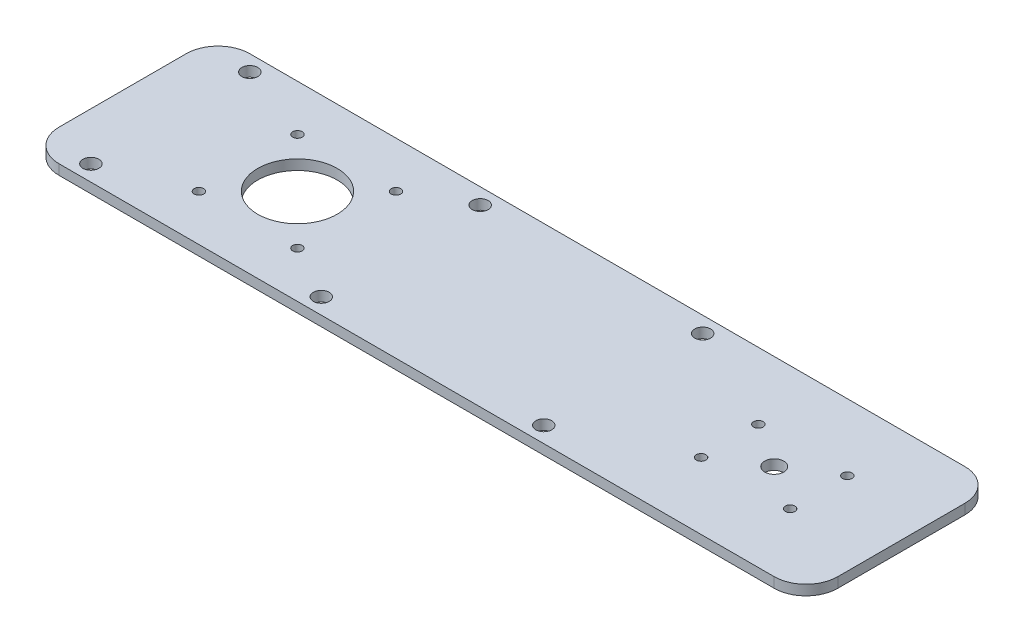
ISO-10303-21;
HEADER;
FILE_DESCRIPTION(('STEP AP214'),'2;1');
FILE_NAME('part.step','',(''),(''),'','','');
FILE_SCHEMA(('AUTOMOTIVE_DESIGN { 1 0 10303 214 1 1 1 1 }'));
ENDSEC;
DATA;
#1=APPLICATION_CONTEXT('core data for automotive mechanical design processes');
#2=APPLICATION_PROTOCOL_DEFINITION('international standard','automotive_design',2000,#1);
#3=PRODUCT_CONTEXT('',#1,'mechanical');
#4=PRODUCT('Part','Part','',(#3));
#5=PRODUCT_RELATED_PRODUCT_CATEGORY('part','',(#4));
#6=PRODUCT_DEFINITION_FORMATION('','',#4);
#7=PRODUCT_DEFINITION_CONTEXT('part definition',#1,'design');
#8=PRODUCT_DEFINITION('design','',#6,#7);
#9=PRODUCT_DEFINITION_SHAPE('','',#8);
#10=(LENGTH_UNIT() NAMED_UNIT(*) SI_UNIT(.MILLI.,.METRE.));
#11=(NAMED_UNIT(*) PLANE_ANGLE_UNIT() SI_UNIT($,.RADIAN.));
#12=(NAMED_UNIT(*) SI_UNIT($,.STERADIAN.) SOLID_ANGLE_UNIT());
#13=UNCERTAINTY_MEASURE_WITH_UNIT(LENGTH_MEASURE(1.E-05),#10,'distance_accuracy_value','');
#14=(GEOMETRIC_REPRESENTATION_CONTEXT(3) GLOBAL_UNCERTAINTY_ASSIGNED_CONTEXT((#13)) GLOBAL_UNIT_ASSIGNED_CONTEXT((#10,
#11,#12)) REPRESENTATION_CONTEXT('',''));
#15=CARTESIAN_POINT('',(0.,0.,0.));
#16=DIRECTION('',(0.,0.,1.));
#17=DIRECTION('',(1.,0.,0.));
#18=AXIS2_PLACEMENT_3D('',#15,#16,#17);
#19=CARTESIAN_POINT('',(0.,0.,0.));
#20=DIRECTION('',(0.,1.,0.));
#21=DIRECTION('',(0.,0.,1.));
#22=AXIS2_PLACEMENT_3D('',#19,#20,#21);
#23=PLANE('',#22);
#24=CARTESIAN_POINT('',(32.5,0.,25.));
#25=DIRECTION('',(0.,1.,0.));
#26=DIRECTION('',(0.,0.,1.));
#27=AXIS2_PLACEMENT_3D('',#24,#25,#26);
#28=CIRCLE('',#27,2.5);
#29=CARTESIAN_POINT('',(32.5,0.,27.5));
#30=VERTEX_POINT('',#29);
#31=EDGE_CURVE('E330',#30,#30,#28,.T.);
#32=ORIENTED_EDGE('',*,*,#31,.T.);
#33=EDGE_LOOP('',(#32));
#34=FACE_BOUND('',#33,.T.);
#35=CARTESIAN_POINT('',(102.5,0.,25.));
#36=DIRECTION('',(0.,1.,0.));
#37=DIRECTION('',(0.,0.,1.));
#38=AXIS2_PLACEMENT_3D('',#35,#36,#37);
#39=CIRCLE('',#38,2.5);
#40=CARTESIAN_POINT('',(102.5,0.,27.5));
#41=VERTEX_POINT('',#40);
#42=EDGE_CURVE('E322',#41,#41,#39,.T.);
#43=ORIENTED_EDGE('',*,*,#42,.T.);
#44=EDGE_LOOP('',(#43));
#45=FACE_BOUND('',#44,.T.);
#46=CARTESIAN_POINT('',(102.5,0.,-25.));
#47=DIRECTION('',(0.,1.,0.));
#48=DIRECTION('',(0.,0.,1.));
#49=AXIS2_PLACEMENT_3D('',#46,#47,#48);
#50=CIRCLE('',#49,2.5);
#51=CARTESIAN_POINT('',(102.5,0.,-22.5));
#52=VERTEX_POINT('',#51);
#53=EDGE_CURVE('E314',#52,#52,#50,.T.);
#54=ORIENTED_EDGE('',*,*,#53,.T.);
#55=EDGE_LOOP('',(#54));
#56=FACE_BOUND('',#55,.T.);
#57=CARTESIAN_POINT('',(32.5,0.,-25.));
#58=DIRECTION('',(0.,1.,0.));
#59=DIRECTION('',(0.,0.,1.));
#60=AXIS2_PLACEMENT_3D('',#57,#58,#59);
#61=CIRCLE('',#60,2.5);
#62=CARTESIAN_POINT('',(32.5,0.,-22.5));
#63=VERTEX_POINT('',#62);
#64=EDGE_CURVE('E306',#63,#63,#61,.T.);
#65=ORIENTED_EDGE('',*,*,#64,.T.);
#66=EDGE_LOOP('',(#65));
#67=FACE_BOUND('',#66,.T.);
#68=CARTESIAN_POINT('',(-40.,0.,25.));
#69=DIRECTION('',(0.,1.,0.));
#70=DIRECTION('',(0.,0.,1.));
#71=AXIS2_PLACEMENT_3D('',#68,#69,#70);
#72=CIRCLE('',#71,2.5);
#73=CARTESIAN_POINT('',(-40.,0.,27.5));
#74=VERTEX_POINT('',#73);
#75=EDGE_CURVE('E298',#74,#74,#72,.T.);
#76=ORIENTED_EDGE('',*,*,#75,.T.);
#77=EDGE_LOOP('',(#76));
#78=FACE_BOUND('',#77,.T.);
#79=CARTESIAN_POINT('',(-40.,0.,-25.));
#80=DIRECTION('',(0.,1.,0.));
#81=DIRECTION('',(0.,0.,1.));
#82=AXIS2_PLACEMENT_3D('',#79,#80,#81);
#83=CIRCLE('',#82,2.5);
#84=CARTESIAN_POINT('',(-40.,0.,-22.5));
#85=VERTEX_POINT('',#84);
#86=EDGE_CURVE('E290',#85,#85,#83,.T.);
#87=ORIENTED_EDGE('',*,*,#86,.T.);
#88=EDGE_LOOP('',(#87));
#89=FACE_BOUND('',#88,.T.);
#90=CARTESIAN_POINT('',(164.,0.,9.));
#91=DIRECTION('',(0.,-1.,0.));
#92=DIRECTION('',(0.,0.,-1.));
#93=AXIS2_PLACEMENT_3D('',#90,#91,#92);
#94=CIRCLE('',#93,1.5);
#95=CARTESIAN_POINT('',(164.,0.,7.5));
#96=VERTEX_POINT('',#95);
#97=EDGE_CURVE('E262',#96,#96,#94,.T.);
#98=ORIENTED_EDGE('',*,*,#97,.F.);
#99=EDGE_LOOP('',(#98));
#100=FACE_BOUND('',#99,.T.);
#101=CARTESIAN_POINT('',(150.,0.,0.));
#102=DIRECTION('',(0.,1.,0.));
#103=DIRECTION('',(0.,0.,1.));
#104=AXIS2_PLACEMENT_3D('',#101,#102,#103);
#105=CIRCLE('',#104,3.);
#106=CARTESIAN_POINT('',(150.,0.,3.));
#107=VERTEX_POINT('',#106);
#108=EDGE_CURVE('E247',#107,#107,#105,.T.);
#109=ORIENTED_EDGE('',*,*,#108,.T.);
#110=EDGE_LOOP('',(#109));
#111=FACE_BOUND('',#110,.T.);
#112=CARTESIAN_POINT('',(0.,0.,0.));
#113=DIRECTION('',(0.,1.,0.));
#114=DIRECTION('',(0.,0.,1.));
#115=AXIS2_PLACEMENT_3D('',#112,#113,#114);
#116=CIRCLE('',#115,12.5);
#117=CARTESIAN_POINT('',(0.,0.,12.5));
#118=VERTEX_POINT('',#117);
#119=EDGE_CURVE('E242',#118,#118,#116,.T.);
#120=ORIENTED_EDGE('',*,*,#119,.T.);
#121=EDGE_LOOP('',(#120));
#122=FACE_BOUND('',#121,.T.);
#123=CARTESIAN_POINT('',(-15.5,0.,-15.5));
#124=DIRECTION('',(0.,1.,0.));
#125=DIRECTION('',(0.,0.,1.));
#126=AXIS2_PLACEMENT_3D('',#123,#124,#125);
#127=CIRCLE('',#126,1.5);
#128=CARTESIAN_POINT('',(-15.5,0.,-14.));
#129=VERTEX_POINT('',#128);
#130=EDGE_CURVE('E234',#129,#129,#127,.T.);
#131=ORIENTED_EDGE('',*,*,#130,.T.);
#132=EDGE_LOOP('',(#131));
#133=FACE_BOUND('',#132,.T.);
#134=CARTESIAN_POINT('',(15.5,0.,-15.5000000000002));
#135=DIRECTION('',(0.,1.,0.));
#136=DIRECTION('',(0.,0.,1.));
#137=AXIS2_PLACEMENT_3D('',#134,#135,#136);
#138=CIRCLE('',#137,1.5);
#139=CARTESIAN_POINT('',(15.5,0.,-14.0000000000002));
#140=VERTEX_POINT('',#139);
#141=EDGE_CURVE('E226',#140,#140,#138,.T.);
#142=ORIENTED_EDGE('',*,*,#141,.T.);
#143=EDGE_LOOP('',(#142));
#144=FACE_BOUND('',#143,.T.);
#145=CARTESIAN_POINT('',(15.5,0.,15.4999999999998));
#146=DIRECTION('',(0.,1.,0.));
#147=DIRECTION('',(0.,0.,1.));
#148=AXIS2_PLACEMENT_3D('',#145,#146,#147);
#149=CIRCLE('',#148,1.5);
#150=CARTESIAN_POINT('',(15.5,0.,16.9999999999998));
#151=VERTEX_POINT('',#150);
#152=EDGE_CURVE('E218',#151,#151,#149,.T.);
#153=ORIENTED_EDGE('',*,*,#152,.T.);
#154=EDGE_LOOP('',(#153));
#155=FACE_BOUND('',#154,.T.);
#156=CARTESIAN_POINT('',(-15.5,0.,15.5000000000002));
#157=DIRECTION('',(0.,1.,0.));
#158=DIRECTION('',(0.,0.,1.));
#159=AXIS2_PLACEMENT_3D('',#156,#157,#158);
#160=CIRCLE('',#159,1.5);
#161=CARTESIAN_POINT('',(-15.5,0.,17.0000000000002));
#162=VERTEX_POINT('',#161);
#163=EDGE_CURVE('E145',#162,#162,#160,.T.);
#164=ORIENTED_EDGE('',*,*,#163,.T.);
#165=EDGE_LOOP('',(#164));
#166=FACE_BOUND('',#165,.T.);
#167=DIRECTION('',(1.,0.,0.));
#168=VECTOR('',#167,1.);
#169=CARTESIAN_POINT('',(-55.,0.,30.));
#170=LINE('',#169,#168);
#171=CARTESIAN_POINT('',(-45.,0.,30.));
#172=VERTEX_POINT('',#171);
#173=CARTESIAN_POINT('',(180.,0.,30.));
#174=VERTEX_POINT('',#173);
#175=EDGE_CURVE('E125',#172,#174,#170,.T.);
#176=ORIENTED_EDGE('',*,*,#175,.F.);
#177=CARTESIAN_POINT('',(-45.,0.,20.));
#178=DIRECTION('',(0.,1.,0.));
#179=DIRECTION('',(0.,0.,1.));
#180=AXIS2_PLACEMENT_3D('',#177,#178,#179);
#181=CIRCLE('',#180,10.);
#182=CARTESIAN_POINT('',(-55.,0.,20.));
#183=VERTEX_POINT('',#182);
#184=EDGE_CURVE('E107',#172,#183,#181,.F.);
#185=ORIENTED_EDGE('',*,*,#184,.T.);
#186=DIRECTION('',(0.,0.,1.));
#187=VECTOR('',#186,1.);
#188=CARTESIAN_POINT('',(-55.,0.,-30.));
#189=LINE('',#188,#187);
#190=CARTESIAN_POINT('',(-55.,0.,-20.));
#191=VERTEX_POINT('',#190);
#192=EDGE_CURVE('E138',#191,#183,#189,.T.);
#193=ORIENTED_EDGE('',*,*,#192,.F.);
#194=CARTESIAN_POINT('',(-45.,0.,-20.));
#195=DIRECTION('',(0.,1.,0.));
#196=DIRECTION('',(0.,0.,1.));
#197=AXIS2_PLACEMENT_3D('',#194,#195,#196);
#198=CIRCLE('',#197,10.);
#199=CARTESIAN_POINT('',(-45.,0.,-30.));
#200=VERTEX_POINT('',#199);
#201=EDGE_CURVE('E119',#191,#200,#198,.F.);
#202=ORIENTED_EDGE('',*,*,#201,.T.);
#203=DIRECTION('',(-1.,0.,0.));
#204=VECTOR('',#203,1.);
#205=CARTESIAN_POINT('',(-55.,0.,-30.));
#206=LINE('',#205,#204);
#207=CARTESIAN_POINT('',(180.,0.,-30.));
#208=VERTEX_POINT('',#207);
#209=EDGE_CURVE('E143',#208,#200,#206,.T.);
#210=ORIENTED_EDGE('',*,*,#209,.F.);
#211=CARTESIAN_POINT('',(180.,0.,-20.));
#212=DIRECTION('',(0.,1.,0.));
#213=DIRECTION('',(0.,0.,1.));
#214=AXIS2_PLACEMENT_3D('',#211,#212,#213);
#215=CIRCLE('',#214,10.);
#216=CARTESIAN_POINT('',(190.,0.,-20.));
#217=VERTEX_POINT('',#216);
#218=EDGE_CURVE('E130',#208,#217,#215,.F.);
#219=ORIENTED_EDGE('',*,*,#218,.T.);
#220=DIRECTION('',(0.,0.,-1.));
#221=VECTOR('',#220,1.);
#222=CARTESIAN_POINT('',(190.,0.,-30.));
#223=LINE('',#222,#221);
#224=CARTESIAN_POINT('',(190.,0.,20.));
#225=VERTEX_POINT('',#224);
#226=EDGE_CURVE('E137',#225,#217,#223,.T.);
#227=ORIENTED_EDGE('',*,*,#226,.F.);
#228=CARTESIAN_POINT('',(180.,0.,20.));
#229=DIRECTION('',(0.,1.,0.));
#230=DIRECTION('',(0.,0.,1.));
#231=AXIS2_PLACEMENT_3D('',#228,#229,#230);
#232=CIRCLE('',#231,10.);
#233=EDGE_CURVE('E135',#225,#174,#232,.F.);
#234=ORIENTED_EDGE('',*,*,#233,.T.);
#235=EDGE_LOOP('',(#176,#185,#193,#202,#210,#219,#227,#234));
#236=FACE_BOUND('',#235,.T.);
#237=CARTESIAN_POINT('',(136.,0.,9.));
#238=DIRECTION('',(0.,-1.,0.));
#239=DIRECTION('',(0.,0.,-1.));
#240=AXIS2_PLACEMENT_3D('',#237,#238,#239);
#241=CIRCLE('',#240,1.5);
#242=CARTESIAN_POINT('',(136.,0.,7.5));
#243=VERTEX_POINT('',#242);
#244=EDGE_CURVE('E270',#243,#243,#241,.T.);
#245=ORIENTED_EDGE('',*,*,#244,.F.);
#246=EDGE_LOOP('',(#245));
#247=FACE_BOUND('',#246,.T.);
#248=CARTESIAN_POINT('',(136.,0.,-9.));
#249=DIRECTION('',(0.,-1.,0.));
#250=DIRECTION('',(0.,0.,-1.));
#251=AXIS2_PLACEMENT_3D('',#248,#249,#250);
#252=CIRCLE('',#251,1.5);
#253=CARTESIAN_POINT('',(136.,0.,-10.5));
#254=VERTEX_POINT('',#253);
#255=EDGE_CURVE('E278',#254,#254,#252,.T.);
#256=ORIENTED_EDGE('',*,*,#255,.F.);
#257=EDGE_LOOP('',(#256));
#258=FACE_BOUND('',#257,.T.);
#259=CARTESIAN_POINT('',(164.,0.,-9.));
#260=DIRECTION('',(0.,-1.,0.));
#261=DIRECTION('',(0.,0.,-1.));
#262=AXIS2_PLACEMENT_3D('',#259,#260,#261);
#263=CIRCLE('',#262,1.5);
#264=CARTESIAN_POINT('',(164.,0.,-10.5));
#265=VERTEX_POINT('',#264);
#266=EDGE_CURVE('E286',#265,#265,#263,.T.);
#267=ORIENTED_EDGE('',*,*,#266,.F.);
#268=EDGE_LOOP('',(#267));
#269=FACE_BOUND('',#268,.T.);
#270=ADVANCED_FACE('F39',(#34,#45,#56,#67,#78,#89,#100,#111,#122,#133,#144,#155,#166,#236,#247,
#258,#269),#23,.F.);
#271=CARTESIAN_POINT('',(-55.,3.175,-30.));
#272=DIRECTION('',(1.,0.,0.));
#273=DIRECTION('',(0.,0.,-1.));
#274=AXIS2_PLACEMENT_3D('',#271,#272,#273);
#275=PLANE('',#274);
#276=ORIENTED_EDGE('',*,*,#192,.T.);
#277=DIRECTION('',(0.,-1.,0.));
#278=VECTOR('',#277,1.);
#279=CARTESIAN_POINT('',(-55.,3.175,20.));
#280=LINE('',#279,#278);
#281=CARTESIAN_POINT('',(-55.,3.175,20.));
#282=VERTEX_POINT('',#281);
#283=EDGE_CURVE('E112',#183,#282,#280,.F.);
#284=ORIENTED_EDGE('',*,*,#283,.T.);
#285=DIRECTION('',(0.,0.,1.));
#286=VECTOR('',#285,1.);
#287=CARTESIAN_POINT('',(-55.,3.175,-30.));
#288=LINE('',#287,#286);
#289=CARTESIAN_POINT('',(-55.,3.175,-20.));
#290=VERTEX_POINT('',#289);
#291=EDGE_CURVE('E151',#290,#282,#288,.T.);
#292=ORIENTED_EDGE('',*,*,#291,.F.);
#293=DIRECTION('',(0.,-1.,0.));
#294=VECTOR('',#293,1.);
#295=CARTESIAN_POINT('',(-55.,3.175,-20.));
#296=LINE('',#295,#294);
#297=EDGE_CURVE('E118',#290,#191,#296,.T.);
#298=ORIENTED_EDGE('',*,*,#297,.T.);
#299=EDGE_LOOP('',(#276,#284,#292,#298));
#300=FACE_BOUND('',#299,.T.);
#301=ADVANCED_FACE('F204',(#300),#275,.F.);
#302=CARTESIAN_POINT('',(-55.,3.175,30.));
#303=DIRECTION('',(0.,0.,-1.));
#304=DIRECTION('',(-1.,0.,0.));
#305=AXIS2_PLACEMENT_3D('',#302,#303,#304);
#306=PLANE('',#305);
#307=DIRECTION('',(1.,0.,0.));
#308=VECTOR('',#307,1.);
#309=CARTESIAN_POINT('',(-55.,3.175,30.));
#310=LINE('',#309,#308);
#311=CARTESIAN_POINT('',(-45.,3.175,30.));
#312=VERTEX_POINT('',#311);
#313=CARTESIAN_POINT('',(180.,3.175,30.));
#314=VERTEX_POINT('',#313);
#315=EDGE_CURVE('E128',#312,#314,#310,.T.);
#316=ORIENTED_EDGE('',*,*,#315,.F.);
#317=DIRECTION('',(0.,-1.,0.));
#318=VECTOR('',#317,1.);
#319=CARTESIAN_POINT('',(-45.,3.175,30.));
#320=LINE('',#319,#318);
#321=EDGE_CURVE('E111',#312,#172,#320,.T.);
#322=ORIENTED_EDGE('',*,*,#321,.T.);
#323=ORIENTED_EDGE('',*,*,#175,.T.);
#324=DIRECTION('',(0.,-1.,0.));
#325=VECTOR('',#324,1.);
#326=CARTESIAN_POINT('',(180.,3.175,30.));
#327=LINE('',#326,#325);
#328=EDGE_CURVE('E131',#174,#314,#327,.F.);
#329=ORIENTED_EDGE('',*,*,#328,.T.);
#330=EDGE_LOOP('',(#316,#322,#323,#329));
#331=FACE_BOUND('',#330,.T.);
#332=ADVANCED_FACE('F124',(#331),#306,.F.);
#333=CARTESIAN_POINT('',(190.,3.175,-30.));
#334=DIRECTION('',(-1.,0.,0.));
#335=DIRECTION('',(0.,0.,1.));
#336=AXIS2_PLACEMENT_3D('',#333,#334,#335);
#337=PLANE('',#336);
#338=DIRECTION('',(0.,0.,-1.));
#339=VECTOR('',#338,1.);
#340=CARTESIAN_POINT('',(190.,3.175,-30.));
#341=LINE('',#340,#339);
#342=CARTESIAN_POINT('',(190.,3.175,20.));
#343=VERTEX_POINT('',#342);
#344=CARTESIAN_POINT('',(190.,3.175,-20.));
#345=VERTEX_POINT('',#344);
#346=EDGE_CURVE('E187',#343,#345,#341,.T.);
#347=ORIENTED_EDGE('',*,*,#346,.F.);
#348=DIRECTION('',(0.,-1.,0.));
#349=VECTOR('',#348,1.);
#350=CARTESIAN_POINT('',(190.,3.175,20.));
#351=LINE('',#350,#349);
#352=EDGE_CURVE('E11',#343,#225,#351,.T.);
#353=ORIENTED_EDGE('',*,*,#352,.T.);
#354=ORIENTED_EDGE('',*,*,#226,.T.);
#355=DIRECTION('',(0.,-1.,0.));
#356=VECTOR('',#355,1.);
#357=CARTESIAN_POINT('',(190.,3.175,-20.));
#358=LINE('',#357,#356);
#359=EDGE_CURVE('E48',#217,#345,#358,.F.);
#360=ORIENTED_EDGE('',*,*,#359,.T.);
#361=EDGE_LOOP('',(#347,#353,#354,#360));
#362=FACE_BOUND('',#361,.T.);
#363=ADVANCED_FACE('F186',(#362),#337,.F.);
#364=CARTESIAN_POINT('',(-55.,3.175,-30.));
#365=DIRECTION('',(0.,0.,1.));
#366=DIRECTION('',(1.,0.,0.));
#367=AXIS2_PLACEMENT_3D('',#364,#365,#366);
#368=PLANE('',#367);
#369=ORIENTED_EDGE('',*,*,#209,.T.);
#370=DIRECTION('',(0.,-1.,0.));
#371=VECTOR('',#370,1.);
#372=CARTESIAN_POINT('',(-45.,3.175,-30.));
#373=LINE('',#372,#371);
#374=CARTESIAN_POINT('',(-45.,3.175,-30.));
#375=VERTEX_POINT('',#374);
#376=EDGE_CURVE('E55',#200,#375,#373,.F.);
#377=ORIENTED_EDGE('',*,*,#376,.T.);
#378=DIRECTION('',(-1.,0.,0.));
#379=VECTOR('',#378,1.);
#380=CARTESIAN_POINT('',(-55.,3.175,-30.));
#381=LINE('',#380,#379);
#382=CARTESIAN_POINT('',(180.,3.175,-30.));
#383=VERTEX_POINT('',#382);
#384=EDGE_CURVE('E153',#383,#375,#381,.T.);
#385=ORIENTED_EDGE('',*,*,#384,.F.);
#386=DIRECTION('',(0.,-1.,0.));
#387=VECTOR('',#386,1.);
#388=CARTESIAN_POINT('',(180.,3.175,-30.));
#389=LINE('',#388,#387);
#390=EDGE_CURVE('E177',#383,#208,#389,.T.);
#391=ORIENTED_EDGE('',*,*,#390,.T.);
#392=EDGE_LOOP('',(#369,#377,#385,#391));
#393=FACE_BOUND('',#392,.T.);
#394=ADVANCED_FACE('F197',(#393),#368,.F.);
#395=CARTESIAN_POINT('',(0.,3.175,0.));
#396=DIRECTION('',(0.,1.,0.));
#397=DIRECTION('',(0.,0.,1.));
#398=AXIS2_PLACEMENT_3D('',#395,#396,#397);
#399=PLANE('',#398);
#400=CARTESIAN_POINT('',(32.5,3.175,25.));
#401=DIRECTION('',(0.,1.,0.));
#402=DIRECTION('',(0.,0.,1.));
#403=AXIS2_PLACEMENT_3D('',#400,#401,#402);
#404=CIRCLE('',#403,2.5);
#405=CARTESIAN_POINT('',(32.5,3.175,27.5));
#406=VERTEX_POINT('',#405);
#407=EDGE_CURVE('E334',#406,#406,#404,.T.);
#408=ORIENTED_EDGE('',*,*,#407,.F.);
#409=EDGE_LOOP('',(#408));
#410=FACE_BOUND('',#409,.T.);
#411=CARTESIAN_POINT('',(102.5,3.175,25.));
#412=DIRECTION('',(0.,1.,0.));
#413=DIRECTION('',(0.,0.,1.));
#414=AXIS2_PLACEMENT_3D('',#411,#412,#413);
#415=CIRCLE('',#414,2.5);
#416=CARTESIAN_POINT('',(102.5,3.175,27.5));
#417=VERTEX_POINT('',#416);
#418=EDGE_CURVE('E326',#417,#417,#415,.T.);
#419=ORIENTED_EDGE('',*,*,#418,.F.);
#420=EDGE_LOOP('',(#419));
#421=FACE_BOUND('',#420,.T.);
#422=CARTESIAN_POINT('',(102.5,3.175,-25.));
#423=DIRECTION('',(0.,1.,0.));
#424=DIRECTION('',(0.,0.,1.));
#425=AXIS2_PLACEMENT_3D('',#422,#423,#424);
#426=CIRCLE('',#425,2.5);
#427=CARTESIAN_POINT('',(102.5,3.175,-22.5));
#428=VERTEX_POINT('',#427);
#429=EDGE_CURVE('E318',#428,#428,#426,.T.);
#430=ORIENTED_EDGE('',*,*,#429,.F.);
#431=EDGE_LOOP('',(#430));
#432=FACE_BOUND('',#431,.T.);
#433=CARTESIAN_POINT('',(32.5,3.175,-25.));
#434=DIRECTION('',(0.,1.,0.));
#435=DIRECTION('',(0.,0.,1.));
#436=AXIS2_PLACEMENT_3D('',#433,#434,#435);
#437=CIRCLE('',#436,2.5);
#438=CARTESIAN_POINT('',(32.5,3.175,-22.5));
#439=VERTEX_POINT('',#438);
#440=EDGE_CURVE('E310',#439,#439,#437,.T.);
#441=ORIENTED_EDGE('',*,*,#440,.F.);
#442=EDGE_LOOP('',(#441));
#443=FACE_BOUND('',#442,.T.);
#444=CARTESIAN_POINT('',(-40.,3.175,25.));
#445=DIRECTION('',(0.,1.,0.));
#446=DIRECTION('',(0.,0.,1.));
#447=AXIS2_PLACEMENT_3D('',#444,#445,#446);
#448=CIRCLE('',#447,2.5);
#449=CARTESIAN_POINT('',(-40.,3.175,27.5));
#450=VERTEX_POINT('',#449);
#451=EDGE_CURVE('E302',#450,#450,#448,.T.);
#452=ORIENTED_EDGE('',*,*,#451,.F.);
#453=EDGE_LOOP('',(#452));
#454=FACE_BOUND('',#453,.T.);
#455=CARTESIAN_POINT('',(-40.,3.175,-25.));
#456=DIRECTION('',(0.,1.,0.));
#457=DIRECTION('',(0.,0.,1.));
#458=AXIS2_PLACEMENT_3D('',#455,#456,#457);
#459=CIRCLE('',#458,2.5);
#460=CARTESIAN_POINT('',(-40.,3.175,-22.5));
#461=VERTEX_POINT('',#460);
#462=EDGE_CURVE('E294',#461,#461,#459,.T.);
#463=ORIENTED_EDGE('',*,*,#462,.F.);
#464=EDGE_LOOP('',(#463));
#465=FACE_BOUND('',#464,.T.);
#466=CARTESIAN_POINT('',(164.,3.175,-9.));
#467=DIRECTION('',(0.,1.,0.));
#468=DIRECTION('',(0.,0.,1.));
#469=AXIS2_PLACEMENT_3D('',#466,#467,#468);
#470=CIRCLE('',#469,1.5);
#471=CARTESIAN_POINT('',(164.,3.175,-7.5));
#472=VERTEX_POINT('',#471);
#473=EDGE_CURVE('E282',#472,#472,#470,.T.);
#474=ORIENTED_EDGE('',*,*,#473,.F.);
#475=EDGE_LOOP('',(#474));
#476=FACE_BOUND('',#475,.T.);
#477=CARTESIAN_POINT('',(136.,3.175,-9.));
#478=DIRECTION('',(0.,1.,0.));
#479=DIRECTION('',(0.,0.,1.));
#480=AXIS2_PLACEMENT_3D('',#477,#478,#479);
#481=CIRCLE('',#480,1.5);
#482=CARTESIAN_POINT('',(136.,3.175,-7.5));
#483=VERTEX_POINT('',#482);
#484=EDGE_CURVE('E274',#483,#483,#481,.T.);
#485=ORIENTED_EDGE('',*,*,#484,.F.);
#486=EDGE_LOOP('',(#485));
#487=FACE_BOUND('',#486,.T.);
#488=CARTESIAN_POINT('',(136.,3.175,9.));
#489=DIRECTION('',(0.,1.,0.));
#490=DIRECTION('',(0.,0.,1.));
#491=AXIS2_PLACEMENT_3D('',#488,#489,#490);
#492=CIRCLE('',#491,1.5);
#493=CARTESIAN_POINT('',(136.,3.175,10.5));
#494=VERTEX_POINT('',#493);
#495=EDGE_CURVE('E266',#494,#494,#492,.T.);
#496=ORIENTED_EDGE('',*,*,#495,.F.);
#497=EDGE_LOOP('',(#496));
#498=FACE_BOUND('',#497,.T.);
#499=CARTESIAN_POINT('',(164.,3.175,9.));
#500=DIRECTION('',(0.,1.,0.));
#501=DIRECTION('',(0.,0.,1.));
#502=AXIS2_PLACEMENT_3D('',#499,#500,#501);
#503=CIRCLE('',#502,1.5);
#504=CARTESIAN_POINT('',(164.,3.175,10.5));
#505=VERTEX_POINT('',#504);
#506=EDGE_CURVE('E258',#505,#505,#503,.T.);
#507=ORIENTED_EDGE('',*,*,#506,.F.);
#508=EDGE_LOOP('',(#507));
#509=FACE_BOUND('',#508,.T.);
#510=CARTESIAN_POINT('',(150.,3.175,0.));
#511=DIRECTION('',(0.,1.,0.));
#512=DIRECTION('',(0.,0.,1.));
#513=AXIS2_PLACEMENT_3D('',#510,#511,#512);
#514=CIRCLE('',#513,3.);
#515=CARTESIAN_POINT('',(150.,3.175,3.));
#516=VERTEX_POINT('',#515);
#517=EDGE_CURVE('E254',#516,#516,#514,.T.);
#518=ORIENTED_EDGE('',*,*,#517,.F.);
#519=EDGE_LOOP('',(#518));
#520=FACE_BOUND('',#519,.T.);
#521=CARTESIAN_POINT('',(0.,3.175,0.));
#522=DIRECTION('',(0.,1.,0.));
#523=DIRECTION('',(0.,0.,1.));
#524=AXIS2_PLACEMENT_3D('',#521,#522,#523);
#525=CIRCLE('',#524,12.5);
#526=CARTESIAN_POINT('',(0.,3.175,12.5));
#527=VERTEX_POINT('',#526);
#528=EDGE_CURVE('E243',#527,#527,#525,.T.);
#529=ORIENTED_EDGE('',*,*,#528,.F.);
#530=EDGE_LOOP('',(#529));
#531=FACE_BOUND('',#530,.T.);
#532=CARTESIAN_POINT('',(-15.5,3.175,-15.5));
#533=DIRECTION('',(0.,1.,0.));
#534=DIRECTION('',(0.,0.,1.));
#535=AXIS2_PLACEMENT_3D('',#532,#533,#534);
#536=CIRCLE('',#535,1.5);
#537=CARTESIAN_POINT('',(-15.5,3.175,-14.));
#538=VERTEX_POINT('',#537);
#539=EDGE_CURVE('E238',#538,#538,#536,.T.);
#540=ORIENTED_EDGE('',*,*,#539,.F.);
#541=EDGE_LOOP('',(#540));
#542=FACE_BOUND('',#541,.T.);
#543=CARTESIAN_POINT('',(15.5,3.175,-15.5000000000002));
#544=DIRECTION('',(0.,1.,0.));
#545=DIRECTION('',(0.,0.,1.));
#546=AXIS2_PLACEMENT_3D('',#543,#544,#545);
#547=CIRCLE('',#546,1.5);
#548=CARTESIAN_POINT('',(15.5,3.175,-14.0000000000002));
#549=VERTEX_POINT('',#548);
#550=EDGE_CURVE('E230',#549,#549,#547,.T.);
#551=ORIENTED_EDGE('',*,*,#550,.F.);
#552=EDGE_LOOP('',(#551));
#553=FACE_BOUND('',#552,.T.);
#554=CARTESIAN_POINT('',(15.5,3.175,15.4999999999998));
#555=DIRECTION('',(0.,1.,0.));
#556=DIRECTION('',(0.,0.,1.));
#557=AXIS2_PLACEMENT_3D('',#554,#555,#556);
#558=CIRCLE('',#557,1.5);
#559=CARTESIAN_POINT('',(15.5,3.175,16.9999999999998));
#560=VERTEX_POINT('',#559);
#561=EDGE_CURVE('E222',#560,#560,#558,.T.);
#562=ORIENTED_EDGE('',*,*,#561,.F.);
#563=EDGE_LOOP('',(#562));
#564=FACE_BOUND('',#563,.T.);
#565=CARTESIAN_POINT('',(-15.5,3.175,15.5000000000002));
#566=DIRECTION('',(0.,1.,0.));
#567=DIRECTION('',(0.,0.,1.));
#568=AXIS2_PLACEMENT_3D('',#565,#566,#567);
#569=CIRCLE('',#568,1.5);
#570=CARTESIAN_POINT('',(-15.5,3.175,17.0000000000002));
#571=VERTEX_POINT('',#570);
#572=EDGE_CURVE('E214',#571,#571,#569,.T.);
#573=ORIENTED_EDGE('',*,*,#572,.F.);
#574=EDGE_LOOP('',(#573));
#575=FACE_BOUND('',#574,.T.);
#576=ORIENTED_EDGE('',*,*,#291,.T.);
#577=CARTESIAN_POINT('',(-45.,3.175,20.));
#578=DIRECTION('',(0.,1.,0.));
#579=DIRECTION('',(0.,0.,1.));
#580=AXIS2_PLACEMENT_3D('',#577,#578,#579);
#581=CIRCLE('',#580,10.);
#582=EDGE_CURVE('E174',#282,#312,#581,.T.);
#583=ORIENTED_EDGE('',*,*,#582,.T.);
#584=ORIENTED_EDGE('',*,*,#315,.T.);
#585=CARTESIAN_POINT('',(180.,3.175,20.));
#586=DIRECTION('',(0.,1.,0.));
#587=DIRECTION('',(0.,0.,1.));
#588=AXIS2_PLACEMENT_3D('',#585,#586,#587);
#589=CIRCLE('',#588,10.);
#590=EDGE_CURVE('E168',#314,#343,#589,.T.);
#591=ORIENTED_EDGE('',*,*,#590,.T.);
#592=ORIENTED_EDGE('',*,*,#346,.T.);
#593=CARTESIAN_POINT('',(180.,3.175,-20.));
#594=DIRECTION('',(0.,1.,0.));
#595=DIRECTION('',(0.,0.,1.));
#596=AXIS2_PLACEMENT_3D('',#593,#594,#595);
#597=CIRCLE('',#596,10.);
#598=EDGE_CURVE('E62',#345,#383,#597,.T.);
#599=ORIENTED_EDGE('',*,*,#598,.T.);
#600=ORIENTED_EDGE('',*,*,#384,.T.);
#601=CARTESIAN_POINT('',(-45.,3.175,-20.));
#602=DIRECTION('',(0.,1.,0.));
#603=DIRECTION('',(0.,0.,1.));
#604=AXIS2_PLACEMENT_3D('',#601,#602,#603);
#605=CIRCLE('',#604,10.);
#606=EDGE_CURVE('E171',#375,#290,#605,.T.);
#607=ORIENTED_EDGE('',*,*,#606,.T.);
#608=EDGE_LOOP('',(#576,#583,#584,#591,#592,#599,#600,#607));
#609=FACE_BOUND('',#608,.T.);
#610=ADVANCED_FACE('F191',(#410,#421,#432,#443,#454,#465,#476,#487,#498,#509,#520,#531,#542,
#553,#564,#575,#609),#399,.T.);
#611=CARTESIAN_POINT('',(-45.,3.175,20.));
#612=DIRECTION('',(0.,-1.,0.));
#613=DIRECTION('',(0.,0.,-1.));
#614=AXIS2_PLACEMENT_3D('',#611,#612,#613);
#615=CYLINDRICAL_SURFACE('',#614,10.);
#616=ORIENTED_EDGE('',*,*,#582,.F.);
#617=ORIENTED_EDGE('',*,*,#283,.F.);
#618=ORIENTED_EDGE('',*,*,#184,.F.);
#619=ORIENTED_EDGE('',*,*,#321,.F.);
#620=EDGE_LOOP('',(#616,#617,#618,#619));
#621=FACE_BOUND('',#620,.T.);
#622=ADVANCED_FACE('F110',(#621),#615,.T.);
#623=CARTESIAN_POINT('',(-45.,3.175,-20.));
#624=DIRECTION('',(0.,-1.,0.));
#625=DIRECTION('',(0.,0.,-1.));
#626=AXIS2_PLACEMENT_3D('',#623,#624,#625);
#627=CYLINDRICAL_SURFACE('',#626,10.);
#628=ORIENTED_EDGE('',*,*,#606,.F.);
#629=ORIENTED_EDGE('',*,*,#376,.F.);
#630=ORIENTED_EDGE('',*,*,#201,.F.);
#631=ORIENTED_EDGE('',*,*,#297,.F.);
#632=EDGE_LOOP('',(#628,#629,#630,#631));
#633=FACE_BOUND('',#632,.T.);
#634=ADVANCED_FACE('F201',(#633),#627,.T.);
#635=CARTESIAN_POINT('',(180.,3.175,20.));
#636=DIRECTION('',(0.,-1.,0.));
#637=DIRECTION('',(0.,0.,-1.));
#638=AXIS2_PLACEMENT_3D('',#635,#636,#637);
#639=CYLINDRICAL_SURFACE('',#638,10.);
#640=ORIENTED_EDGE('',*,*,#590,.F.);
#641=ORIENTED_EDGE('',*,*,#328,.F.);
#642=ORIENTED_EDGE('',*,*,#233,.F.);
#643=ORIENTED_EDGE('',*,*,#352,.F.);
#644=EDGE_LOOP('',(#640,#641,#642,#643));
#645=FACE_BOUND('',#644,.T.);
#646=ADVANCED_FACE('F386',(#645),#639,.T.);
#647=CARTESIAN_POINT('',(180.,3.175,-20.));
#648=DIRECTION('',(0.,-1.,0.));
#649=DIRECTION('',(0.,0.,-1.));
#650=AXIS2_PLACEMENT_3D('',#647,#648,#649);
#651=CYLINDRICAL_SURFACE('',#650,10.);
#652=ORIENTED_EDGE('',*,*,#598,.F.);
#653=ORIENTED_EDGE('',*,*,#359,.F.);
#654=ORIENTED_EDGE('',*,*,#218,.F.);
#655=ORIENTED_EDGE('',*,*,#390,.F.);
#656=EDGE_LOOP('',(#652,#653,#654,#655));
#657=FACE_BOUND('',#656,.T.);
#658=ADVANCED_FACE('F41',(#657),#651,.T.);
#659=CARTESIAN_POINT('',(-15.5,3.175,15.5000000000002));
#660=DIRECTION('',(0.,1.,0.));
#661=DIRECTION('',(0.,0.,1.));
#662=AXIS2_PLACEMENT_3D('',#659,#660,#661);
#663=CYLINDRICAL_SURFACE('',#662,1.5);
#664=ORIENTED_EDGE('',*,*,#163,.F.);
#665=EDGE_LOOP('',(#664));
#666=FACE_BOUND('',#665,.T.);
#667=ORIENTED_EDGE('',*,*,#572,.T.);
#668=EDGE_LOOP('',(#667));
#669=FACE_BOUND('',#668,.T.);
#670=ADVANCED_FACE('F374',(#666,#669),#663,.F.);
#671=CARTESIAN_POINT('',(15.5,3.175,15.4999999999998));
#672=DIRECTION('',(0.,1.,0.));
#673=DIRECTION('',(0.,0.,1.));
#674=AXIS2_PLACEMENT_3D('',#671,#672,#673);
#675=CYLINDRICAL_SURFACE('',#674,1.5);
#676=ORIENTED_EDGE('',*,*,#152,.F.);
#677=EDGE_LOOP('',(#676));
#678=FACE_BOUND('',#677,.T.);
#679=ORIENTED_EDGE('',*,*,#561,.T.);
#680=EDGE_LOOP('',(#679));
#681=FACE_BOUND('',#680,.T.);
#682=ADVANCED_FACE('F376',(#678,#681),#675,.F.);
#683=CARTESIAN_POINT('',(15.5,3.175,-15.5000000000002));
#684=DIRECTION('',(0.,1.,0.));
#685=DIRECTION('',(0.,0.,1.));
#686=AXIS2_PLACEMENT_3D('',#683,#684,#685);
#687=CYLINDRICAL_SURFACE('',#686,1.5);
#688=ORIENTED_EDGE('',*,*,#141,.F.);
#689=EDGE_LOOP('',(#688));
#690=FACE_BOUND('',#689,.T.);
#691=ORIENTED_EDGE('',*,*,#550,.T.);
#692=EDGE_LOOP('',(#691));
#693=FACE_BOUND('',#692,.T.);
#694=ADVANCED_FACE('F383',(#690,#693),#687,.F.);
#695=CARTESIAN_POINT('',(-15.5,3.175,-15.5));
#696=DIRECTION('',(0.,1.,0.));
#697=DIRECTION('',(0.,0.,1.));
#698=AXIS2_PLACEMENT_3D('',#695,#696,#697);
#699=CYLINDRICAL_SURFACE('',#698,1.5);
#700=ORIENTED_EDGE('',*,*,#130,.F.);
#701=EDGE_LOOP('',(#700));
#702=FACE_BOUND('',#701,.T.);
#703=ORIENTED_EDGE('',*,*,#539,.T.);
#704=EDGE_LOOP('',(#703));
#705=FACE_BOUND('',#704,.T.);
#706=ADVANCED_FACE('F435',(#702,#705),#699,.F.);
#707=CARTESIAN_POINT('',(0.,0.,0.));
#708=DIRECTION('',(0.,1.,0.));
#709=DIRECTION('',(0.,0.,1.));
#710=AXIS2_PLACEMENT_3D('',#707,#708,#709);
#711=CYLINDRICAL_SURFACE('',#710,12.5);
#712=ORIENTED_EDGE('',*,*,#119,.F.);
#713=EDGE_LOOP('',(#712));
#714=FACE_BOUND('',#713,.T.);
#715=ORIENTED_EDGE('',*,*,#528,.T.);
#716=EDGE_LOOP('',(#715));
#717=FACE_BOUND('',#716,.T.);
#718=ADVANCED_FACE('F445',(#714,#717),#711,.F.);
#719=CARTESIAN_POINT('',(150.,3.175,0.));
#720=DIRECTION('',(0.,1.,0.));
#721=DIRECTION('',(0.,0.,1.));
#722=AXIS2_PLACEMENT_3D('',#719,#720,#721);
#723=CYLINDRICAL_SURFACE('',#722,3.);
#724=ORIENTED_EDGE('',*,*,#108,.F.);
#725=EDGE_LOOP('',(#724));
#726=FACE_BOUND('',#725,.T.);
#727=ORIENTED_EDGE('',*,*,#517,.T.);
#728=EDGE_LOOP('',(#727));
#729=FACE_BOUND('',#728,.T.);
#730=ADVANCED_FACE('F455',(#726,#729),#723,.F.);
#731=CARTESIAN_POINT('',(164.,0.,9.));
#732=DIRECTION('',(0.,-1.,0.));
#733=DIRECTION('',(0.,0.,-1.));
#734=AXIS2_PLACEMENT_3D('',#731,#732,#733);
#735=CYLINDRICAL_SURFACE('',#734,1.5);
#736=ORIENTED_EDGE('',*,*,#97,.T.);
#737=EDGE_LOOP('',(#736));
#738=FACE_BOUND('',#737,.T.);
#739=ORIENTED_EDGE('',*,*,#506,.T.);
#740=EDGE_LOOP('',(#739));
#741=FACE_BOUND('',#740,.T.);
#742=ADVANCED_FACE('F465',(#738,#741),#735,.F.);
#743=CARTESIAN_POINT('',(136.,0.,9.));
#744=DIRECTION('',(0.,-1.,0.));
#745=DIRECTION('',(0.,0.,-1.));
#746=AXIS2_PLACEMENT_3D('',#743,#744,#745);
#747=CYLINDRICAL_SURFACE('',#746,1.5);
#748=ORIENTED_EDGE('',*,*,#244,.T.);
#749=EDGE_LOOP('',(#748));
#750=FACE_BOUND('',#749,.T.);
#751=ORIENTED_EDGE('',*,*,#495,.T.);
#752=EDGE_LOOP('',(#751));
#753=FACE_BOUND('',#752,.T.);
#754=ADVANCED_FACE('F476',(#750,#753),#747,.F.);
#755=CARTESIAN_POINT('',(136.,0.,-9.));
#756=DIRECTION('',(0.,-1.,0.));
#757=DIRECTION('',(0.,0.,-1.));
#758=AXIS2_PLACEMENT_3D('',#755,#756,#757);
#759=CYLINDRICAL_SURFACE('',#758,1.5);
#760=ORIENTED_EDGE('',*,*,#255,.T.);
#761=EDGE_LOOP('',(#760));
#762=FACE_BOUND('',#761,.T.);
#763=ORIENTED_EDGE('',*,*,#484,.T.);
#764=EDGE_LOOP('',(#763));
#765=FACE_BOUND('',#764,.T.);
#766=ADVANCED_FACE('F486',(#762,#765),#759,.F.);
#767=CARTESIAN_POINT('',(164.,0.,-9.));
#768=DIRECTION('',(0.,-1.,0.));
#769=DIRECTION('',(0.,0.,-1.));
#770=AXIS2_PLACEMENT_3D('',#767,#768,#769);
#771=CYLINDRICAL_SURFACE('',#770,1.5);
#772=ORIENTED_EDGE('',*,*,#266,.T.);
#773=EDGE_LOOP('',(#772));
#774=FACE_BOUND('',#773,.T.);
#775=ORIENTED_EDGE('',*,*,#473,.T.);
#776=EDGE_LOOP('',(#775));
#777=FACE_BOUND('',#776,.T.);
#778=ADVANCED_FACE('F496',(#774,#777),#771,.F.);
#779=CARTESIAN_POINT('',(-40.,3.175,-25.));
#780=DIRECTION('',(0.,1.,0.));
#781=DIRECTION('',(0.,0.,1.));
#782=AXIS2_PLACEMENT_3D('',#779,#780,#781);
#783=CYLINDRICAL_SURFACE('',#782,2.5);
#784=ORIENTED_EDGE('',*,*,#86,.F.);
#785=EDGE_LOOP('',(#784));
#786=FACE_BOUND('',#785,.T.);
#787=ORIENTED_EDGE('',*,*,#462,.T.);
#788=EDGE_LOOP('',(#787));
#789=FACE_BOUND('',#788,.T.);
#790=ADVANCED_FACE('F505',(#786,#789),#783,.F.);
#791=CARTESIAN_POINT('',(-40.,3.175,25.));
#792=DIRECTION('',(0.,1.,0.));
#793=DIRECTION('',(0.,0.,1.));
#794=AXIS2_PLACEMENT_3D('',#791,#792,#793);
#795=CYLINDRICAL_SURFACE('',#794,2.5);
#796=ORIENTED_EDGE('',*,*,#75,.F.);
#797=EDGE_LOOP('',(#796));
#798=FACE_BOUND('',#797,.T.);
#799=ORIENTED_EDGE('',*,*,#451,.T.);
#800=EDGE_LOOP('',(#799));
#801=FACE_BOUND('',#800,.T.);
#802=ADVANCED_FACE('F527',(#798,#801),#795,.F.);
#803=CARTESIAN_POINT('',(32.5,3.175,-25.));
#804=DIRECTION('',(0.,1.,0.));
#805=DIRECTION('',(0.,0.,1.));
#806=AXIS2_PLACEMENT_3D('',#803,#804,#805);
#807=CYLINDRICAL_SURFACE('',#806,2.5);
#808=ORIENTED_EDGE('',*,*,#64,.F.);
#809=EDGE_LOOP('',(#808));
#810=FACE_BOUND('',#809,.T.);
#811=ORIENTED_EDGE('',*,*,#440,.T.);
#812=EDGE_LOOP('',(#811));
#813=FACE_BOUND('',#812,.T.);
#814=ADVANCED_FACE('F537',(#810,#813),#807,.F.);
#815=CARTESIAN_POINT('',(102.5,3.175,-25.));
#816=DIRECTION('',(0.,1.,0.));
#817=DIRECTION('',(0.,0.,1.));
#818=AXIS2_PLACEMENT_3D('',#815,#816,#817);
#819=CYLINDRICAL_SURFACE('',#818,2.5);
#820=ORIENTED_EDGE('',*,*,#53,.F.);
#821=EDGE_LOOP('',(#820));
#822=FACE_BOUND('',#821,.T.);
#823=ORIENTED_EDGE('',*,*,#429,.T.);
#824=EDGE_LOOP('',(#823));
#825=FACE_BOUND('',#824,.T.);
#826=ADVANCED_FACE('F547',(#822,#825),#819,.F.);
#827=CARTESIAN_POINT('',(102.5,3.175,25.));
#828=DIRECTION('',(0.,1.,0.));
#829=DIRECTION('',(0.,0.,1.));
#830=AXIS2_PLACEMENT_3D('',#827,#828,#829);
#831=CYLINDRICAL_SURFACE('',#830,2.5);
#832=ORIENTED_EDGE('',*,*,#42,.F.);
#833=EDGE_LOOP('',(#832));
#834=FACE_BOUND('',#833,.T.);
#835=ORIENTED_EDGE('',*,*,#418,.T.);
#836=EDGE_LOOP('',(#835));
#837=FACE_BOUND('',#836,.T.);
#838=ADVANCED_FACE('F557',(#834,#837),#831,.F.);
#839=CARTESIAN_POINT('',(32.5,3.175,25.));
#840=DIRECTION('',(0.,1.,0.));
#841=DIRECTION('',(0.,0.,1.));
#842=AXIS2_PLACEMENT_3D('',#839,#840,#841);
#843=CYLINDRICAL_SURFACE('',#842,2.5);
#844=ORIENTED_EDGE('',*,*,#31,.F.);
#845=EDGE_LOOP('',(#844));
#846=FACE_BOUND('',#845,.T.);
#847=ORIENTED_EDGE('',*,*,#407,.T.);
#848=EDGE_LOOP('',(#847));
#849=FACE_BOUND('',#848,.T.);
#850=ADVANCED_FACE('F339',(#846,#849),#843,.F.);
#851=CLOSED_SHELL('',(#270,#301,#332,#363,#394,#610,#622,#634,#646,#658,#670,#682,#694,#706,
#718,#730,#742,#754,#766,#778,#790,#802,#814,#826,#838,#850));
#852=MANIFOLD_SOLID_BREP('B2',#851);
#853=ADVANCED_BREP_SHAPE_REPRESENTATION('',(#18,#852),#14);
#854=SHAPE_DEFINITION_REPRESENTATION(#9,#853);
ENDSEC;
END-ISO-10303-21;
